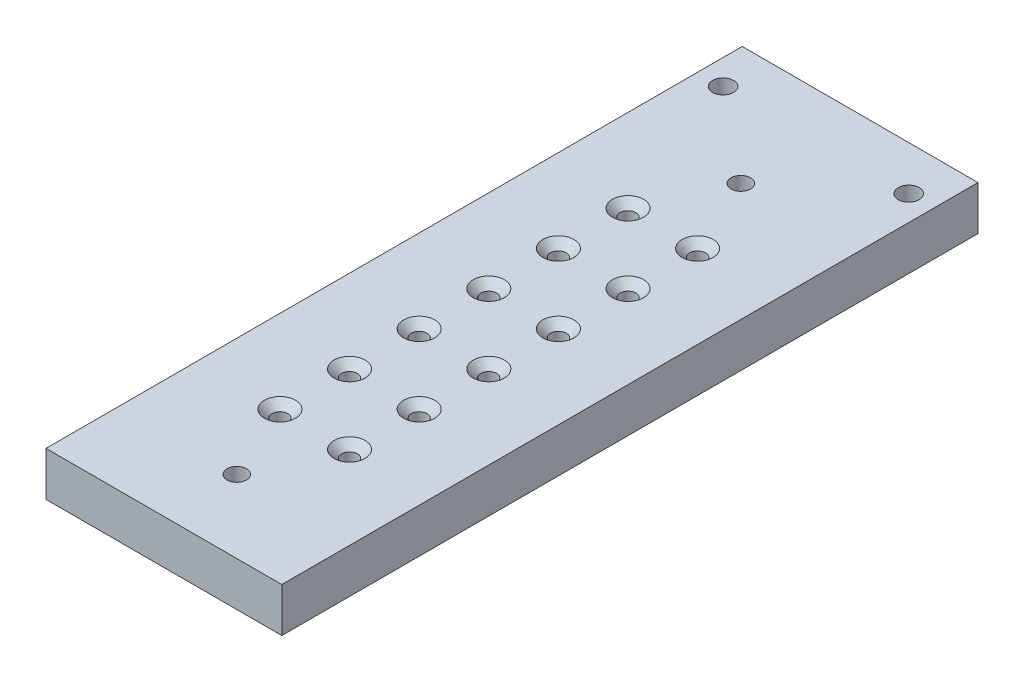
ISO-10303-21;
HEADER;
FILE_DESCRIPTION(('STEP AP214'),'2;1');
FILE_NAME('part.step','',(''),(''),'','','');
FILE_SCHEMA(('AUTOMOTIVE_DESIGN { 1 0 10303 214 1 1 1 1 }'));
ENDSEC;
DATA;
#1=APPLICATION_CONTEXT('core data for automotive mechanical design processes');
#2=APPLICATION_PROTOCOL_DEFINITION('international standard','automotive_design',2000,#1);
#3=PRODUCT_CONTEXT('',#1,'mechanical');
#4=PRODUCT('Part','Part','',(#3));
#5=PRODUCT_RELATED_PRODUCT_CATEGORY('part','',(#4));
#6=PRODUCT_DEFINITION_FORMATION('','',#4);
#7=PRODUCT_DEFINITION_CONTEXT('part definition',#1,'design');
#8=PRODUCT_DEFINITION('design','',#6,#7);
#9=PRODUCT_DEFINITION_SHAPE('','',#8);
#10=(LENGTH_UNIT() NAMED_UNIT(*) SI_UNIT(.MILLI.,.METRE.));
#11=(NAMED_UNIT(*) PLANE_ANGLE_UNIT() SI_UNIT($,.RADIAN.));
#12=(NAMED_UNIT(*) SI_UNIT($,.STERADIAN.) SOLID_ANGLE_UNIT());
#13=UNCERTAINTY_MEASURE_WITH_UNIT(LENGTH_MEASURE(1.E-05),#10,'distance_accuracy_value','');
#14=(GEOMETRIC_REPRESENTATION_CONTEXT(3) GLOBAL_UNCERTAINTY_ASSIGNED_CONTEXT((#13)) GLOBAL_UNIT_ASSIGNED_CONTEXT((#10,
#11,#12)) REPRESENTATION_CONTEXT('',''));
#15=CARTESIAN_POINT('',(0.,0.,0.));
#16=DIRECTION('',(0.,0.,1.));
#17=DIRECTION('',(1.,0.,0.));
#18=AXIS2_PLACEMENT_3D('',#15,#16,#17);
#19=CARTESIAN_POINT('',(-7.5,4.7625,42.5));
#20=DIRECTION('',(0.,1.,0.));
#21=DIRECTION('',(0.,0.,1.));
#22=AXIS2_PLACEMENT_3D('',#19,#20,#21);
#23=CONICAL_SURFACE('',#22,3.36,0.785398163397449);
#24=CARTESIAN_POINT('',(-7.5,3.1025,42.5));
#25=DIRECTION('',(0.,1.,0.));
#26=DIRECTION('',(0.,0.,1.));
#27=AXIS2_PLACEMENT_3D('',#24,#25,#26);
#28=CIRCLE('',#27,1.7);
#29=CARTESIAN_POINT('',(-7.5,3.1025,44.2));
#30=VERTEX_POINT('',#29);
#31=EDGE_CURVE('E11',#30,#30,#28,.T.);
#32=ORIENTED_EDGE('',*,*,#31,.F.);
#33=EDGE_LOOP('',(#32));
#34=FACE_BOUND('',#33,.T.);
#35=CARTESIAN_POINT('',(-7.5,4.7625,42.5));
#36=DIRECTION('',(0.,1.,0.));
#37=DIRECTION('',(0.,0.,1.));
#38=AXIS2_PLACEMENT_3D('',#35,#36,#37);
#39=CIRCLE('',#38,3.36);
#40=CARTESIAN_POINT('',(-7.5,4.7625,45.86));
#41=VERTEX_POINT('',#40);
#42=EDGE_CURVE('E174',#41,#41,#39,.T.);
#43=ORIENTED_EDGE('',*,*,#42,.T.);
#44=EDGE_LOOP('',(#43));
#45=FACE_BOUND('',#44,.T.);
#46=ADVANCED_FACE('F33',(#34,#45),#23,.F.);
#47=CARTESIAN_POINT('',(-7.5,4.7625,42.5));
#48=DIRECTION('',(0.,1.,0.));
#49=DIRECTION('',(0.,0.,1.));
#50=AXIS2_PLACEMENT_3D('',#47,#48,#49);
#51=CYLINDRICAL_SURFACE('',#50,1.7);
#52=CARTESIAN_POINT('',(-7.5,-4.7625,42.5));
#53=DIRECTION('',(0.,1.,0.));
#54=DIRECTION('',(0.,0.,1.));
#55=AXIS2_PLACEMENT_3D('',#52,#53,#54);
#56=CIRCLE('',#55,1.7);
#57=CARTESIAN_POINT('',(-7.5,-4.7625,44.2));
#58=VERTEX_POINT('',#57);
#59=EDGE_CURVE('E41',#58,#58,#56,.T.);
#60=ORIENTED_EDGE('',*,*,#59,.F.);
#61=EDGE_LOOP('',(#60));
#62=FACE_BOUND('',#61,.T.);
#63=ORIENTED_EDGE('',*,*,#31,.T.);
#64=EDGE_LOOP('',(#63));
#65=FACE_BOUND('',#64,.T.);
#66=ADVANCED_FACE('F181',(#62,#65),#51,.F.);
#67=CARTESIAN_POINT('',(-7.5,4.7625,27.5));
#68=DIRECTION('',(0.,1.,0.));
#69=DIRECTION('',(0.,0.,1.));
#70=AXIS2_PLACEMENT_3D('',#67,#68,#69);
#71=CONICAL_SURFACE('',#70,3.36,0.785398163397449);
#72=CARTESIAN_POINT('',(-7.5,3.1025,27.5));
#73=DIRECTION('',(0.,1.,0.));
#74=DIRECTION('',(0.,0.,1.));
#75=AXIS2_PLACEMENT_3D('',#72,#73,#74);
#76=CIRCLE('',#75,1.7);
#77=CARTESIAN_POINT('',(-7.5,3.1025,29.2));
#78=VERTEX_POINT('',#77);
#79=EDGE_CURVE('E171',#78,#78,#76,.T.);
#80=ORIENTED_EDGE('',*,*,#79,.F.);
#81=EDGE_LOOP('',(#80));
#82=FACE_BOUND('',#81,.T.);
#83=CARTESIAN_POINT('',(-7.5,4.7625,27.5));
#84=DIRECTION('',(0.,1.,0.));
#85=DIRECTION('',(0.,0.,1.));
#86=AXIS2_PLACEMENT_3D('',#83,#84,#85);
#87=CIRCLE('',#86,3.36);
#88=CARTESIAN_POINT('',(-7.5,4.7625,30.86));
#89=VERTEX_POINT('',#88);
#90=EDGE_CURVE('E165',#89,#89,#87,.T.);
#91=ORIENTED_EDGE('',*,*,#90,.T.);
#92=EDGE_LOOP('',(#91));
#93=FACE_BOUND('',#92,.T.);
#94=ADVANCED_FACE('F184',(#82,#93),#71,.F.);
#95=CARTESIAN_POINT('',(-7.5,4.7625,27.5));
#96=DIRECTION('',(0.,1.,0.));
#97=DIRECTION('',(0.,0.,1.));
#98=AXIS2_PLACEMENT_3D('',#95,#96,#97);
#99=CYLINDRICAL_SURFACE('',#98,1.7);
#100=CARTESIAN_POINT('',(-7.5,-4.7625,27.5));
#101=DIRECTION('',(0.,1.,0.));
#102=DIRECTION('',(0.,0.,1.));
#103=AXIS2_PLACEMENT_3D('',#100,#101,#102);
#104=CIRCLE('',#103,1.7);
#105=CARTESIAN_POINT('',(-7.5,-4.7625,29.2));
#106=VERTEX_POINT('',#105);
#107=EDGE_CURVE('E168',#106,#106,#104,.T.);
#108=ORIENTED_EDGE('',*,*,#107,.F.);
#109=EDGE_LOOP('',(#108));
#110=FACE_BOUND('',#109,.T.);
#111=ORIENTED_EDGE('',*,*,#79,.T.);
#112=EDGE_LOOP('',(#111));
#113=FACE_BOUND('',#112,.T.);
#114=ADVANCED_FACE('F252',(#110,#113),#99,.F.);
#115=CARTESIAN_POINT('',(-7.5,4.7625,12.5));
#116=DIRECTION('',(0.,1.,0.));
#117=DIRECTION('',(0.,0.,1.));
#118=AXIS2_PLACEMENT_3D('',#115,#116,#117);
#119=CONICAL_SURFACE('',#118,3.36,0.785398163397449);
#120=CARTESIAN_POINT('',(-7.5,3.1025,12.5));
#121=DIRECTION('',(0.,1.,0.));
#122=DIRECTION('',(0.,0.,1.));
#123=AXIS2_PLACEMENT_3D('',#120,#121,#122);
#124=CIRCLE('',#123,1.7);
#125=CARTESIAN_POINT('',(-7.5,3.1025,14.2));
#126=VERTEX_POINT('',#125);
#127=EDGE_CURVE('E162',#126,#126,#124,.T.);
#128=ORIENTED_EDGE('',*,*,#127,.F.);
#129=EDGE_LOOP('',(#128));
#130=FACE_BOUND('',#129,.T.);
#131=CARTESIAN_POINT('',(-7.5,4.7625,12.5));
#132=DIRECTION('',(0.,1.,0.));
#133=DIRECTION('',(0.,0.,1.));
#134=AXIS2_PLACEMENT_3D('',#131,#132,#133);
#135=CIRCLE('',#134,3.36);
#136=CARTESIAN_POINT('',(-7.5,4.7625,15.86));
#137=VERTEX_POINT('',#136);
#138=EDGE_CURVE('E156',#137,#137,#135,.T.);
#139=ORIENTED_EDGE('',*,*,#138,.T.);
#140=EDGE_LOOP('',(#139));
#141=FACE_BOUND('',#140,.T.);
#142=ADVANCED_FACE('F248',(#130,#141),#119,.F.);
#143=CARTESIAN_POINT('',(-7.5,4.7625,12.5));
#144=DIRECTION('',(0.,1.,0.));
#145=DIRECTION('',(0.,0.,1.));
#146=AXIS2_PLACEMENT_3D('',#143,#144,#145);
#147=CYLINDRICAL_SURFACE('',#146,1.7);
#148=CARTESIAN_POINT('',(-7.5,-4.7625,12.5));
#149=DIRECTION('',(0.,1.,0.));
#150=DIRECTION('',(0.,0.,1.));
#151=AXIS2_PLACEMENT_3D('',#148,#149,#150);
#152=CIRCLE('',#151,1.7);
#153=CARTESIAN_POINT('',(-7.5,-4.7625,14.2));
#154=VERTEX_POINT('',#153);
#155=EDGE_CURVE('E159',#154,#154,#152,.T.);
#156=ORIENTED_EDGE('',*,*,#155,.F.);
#157=EDGE_LOOP('',(#156));
#158=FACE_BOUND('',#157,.T.);
#159=ORIENTED_EDGE('',*,*,#127,.T.);
#160=EDGE_LOOP('',(#159));
#161=FACE_BOUND('',#160,.T.);
#162=ADVANCED_FACE('F244',(#158,#161),#147,.F.);
#163=CARTESIAN_POINT('',(-7.5,4.7625,-2.5));
#164=DIRECTION('',(0.,1.,0.));
#165=DIRECTION('',(0.,0.,1.));
#166=AXIS2_PLACEMENT_3D('',#163,#164,#165);
#167=CONICAL_SURFACE('',#166,3.36,0.785398163397449);
#168=CARTESIAN_POINT('',(-7.5,3.1025,-2.5));
#169=DIRECTION('',(0.,1.,0.));
#170=DIRECTION('',(0.,0.,1.));
#171=AXIS2_PLACEMENT_3D('',#168,#169,#170);
#172=CIRCLE('',#171,1.7);
#173=CARTESIAN_POINT('',(-7.5,3.1025,-0.800000000000004));
#174=VERTEX_POINT('',#173);
#175=EDGE_CURVE('E153',#174,#174,#172,.T.);
#176=ORIENTED_EDGE('',*,*,#175,.F.);
#177=EDGE_LOOP('',(#176));
#178=FACE_BOUND('',#177,.T.);
#179=CARTESIAN_POINT('',(-7.5,4.7625,-2.5));
#180=DIRECTION('',(0.,1.,0.));
#181=DIRECTION('',(0.,0.,1.));
#182=AXIS2_PLACEMENT_3D('',#179,#180,#181);
#183=CIRCLE('',#182,3.36);
#184=CARTESIAN_POINT('',(-7.5,4.7625,0.859999999999998));
#185=VERTEX_POINT('',#184);
#186=EDGE_CURVE('E147',#185,#185,#183,.T.);
#187=ORIENTED_EDGE('',*,*,#186,.T.);
#188=EDGE_LOOP('',(#187));
#189=FACE_BOUND('',#188,.T.);
#190=ADVANCED_FACE('F240',(#178,#189),#167,.F.);
#191=CARTESIAN_POINT('',(-7.5,4.7625,-2.5));
#192=DIRECTION('',(0.,1.,0.));
#193=DIRECTION('',(0.,0.,1.));
#194=AXIS2_PLACEMENT_3D('',#191,#192,#193);
#195=CYLINDRICAL_SURFACE('',#194,1.7);
#196=CARTESIAN_POINT('',(-7.5,-4.7625,-2.5));
#197=DIRECTION('',(0.,1.,0.));
#198=DIRECTION('',(0.,0.,1.));
#199=AXIS2_PLACEMENT_3D('',#196,#197,#198);
#200=CIRCLE('',#199,1.7);
#201=CARTESIAN_POINT('',(-7.5,-4.7625,-0.800000000000005));
#202=VERTEX_POINT('',#201);
#203=EDGE_CURVE('E150',#202,#202,#200,.T.);
#204=ORIENTED_EDGE('',*,*,#203,.F.);
#205=EDGE_LOOP('',(#204));
#206=FACE_BOUND('',#205,.T.);
#207=ORIENTED_EDGE('',*,*,#175,.T.);
#208=EDGE_LOOP('',(#207));
#209=FACE_BOUND('',#208,.T.);
#210=ADVANCED_FACE('F236',(#206,#209),#195,.F.);
#211=CARTESIAN_POINT('',(7.5,4.7625,42.5));
#212=DIRECTION('',(0.,1.,0.));
#213=DIRECTION('',(0.,0.,1.));
#214=AXIS2_PLACEMENT_3D('',#211,#212,#213);
#215=CONICAL_SURFACE('',#214,3.36,0.785398163397449);
#216=CARTESIAN_POINT('',(7.5,3.1025,42.5));
#217=DIRECTION('',(0.,1.,0.));
#218=DIRECTION('',(0.,0.,1.));
#219=AXIS2_PLACEMENT_3D('',#216,#217,#218);
#220=CIRCLE('',#219,1.7);
#221=CARTESIAN_POINT('',(7.5,3.1025,44.2));
#222=VERTEX_POINT('',#221);
#223=EDGE_CURVE('E144',#222,#222,#220,.T.);
#224=ORIENTED_EDGE('',*,*,#223,.F.);
#225=EDGE_LOOP('',(#224));
#226=FACE_BOUND('',#225,.T.);
#227=CARTESIAN_POINT('',(7.5,4.7625,42.5));
#228=DIRECTION('',(0.,1.,0.));
#229=DIRECTION('',(0.,0.,1.));
#230=AXIS2_PLACEMENT_3D('',#227,#228,#229);
#231=CIRCLE('',#230,3.36);
#232=CARTESIAN_POINT('',(7.5,4.7625,45.86));
#233=VERTEX_POINT('',#232);
#234=EDGE_CURVE('E138',#233,#233,#231,.T.);
#235=ORIENTED_EDGE('',*,*,#234,.T.);
#236=EDGE_LOOP('',(#235));
#237=FACE_BOUND('',#236,.T.);
#238=ADVANCED_FACE('F232',(#226,#237),#215,.F.);
#239=CARTESIAN_POINT('',(7.5,4.7625,42.5));
#240=DIRECTION('',(0.,1.,0.));
#241=DIRECTION('',(0.,0.,1.));
#242=AXIS2_PLACEMENT_3D('',#239,#240,#241);
#243=CYLINDRICAL_SURFACE('',#242,1.7);
#244=CARTESIAN_POINT('',(7.5,-4.7625,42.5));
#245=DIRECTION('',(0.,1.,0.));
#246=DIRECTION('',(0.,0.,1.));
#247=AXIS2_PLACEMENT_3D('',#244,#245,#246);
#248=CIRCLE('',#247,1.7);
#249=CARTESIAN_POINT('',(7.5,-4.7625,44.2));
#250=VERTEX_POINT('',#249);
#251=EDGE_CURVE('E141',#250,#250,#248,.T.);
#252=ORIENTED_EDGE('',*,*,#251,.F.);
#253=EDGE_LOOP('',(#252));
#254=FACE_BOUND('',#253,.T.);
#255=ORIENTED_EDGE('',*,*,#223,.T.);
#256=EDGE_LOOP('',(#255));
#257=FACE_BOUND('',#256,.T.);
#258=ADVANCED_FACE('F228',(#254,#257),#243,.F.);
#259=CARTESIAN_POINT('',(7.5,4.7625,27.5));
#260=DIRECTION('',(0.,1.,0.));
#261=DIRECTION('',(0.,0.,1.));
#262=AXIS2_PLACEMENT_3D('',#259,#260,#261);
#263=CONICAL_SURFACE('',#262,3.36,0.785398163397449);
#264=CARTESIAN_POINT('',(7.5,3.1025,27.5));
#265=DIRECTION('',(0.,1.,0.));
#266=DIRECTION('',(0.,0.,1.));
#267=AXIS2_PLACEMENT_3D('',#264,#265,#266);
#268=CIRCLE('',#267,1.7);
#269=CARTESIAN_POINT('',(7.5,3.1025,29.2));
#270=VERTEX_POINT('',#269);
#271=EDGE_CURVE('E135',#270,#270,#268,.T.);
#272=ORIENTED_EDGE('',*,*,#271,.F.);
#273=EDGE_LOOP('',(#272));
#274=FACE_BOUND('',#273,.T.);
#275=CARTESIAN_POINT('',(7.5,4.7625,27.5));
#276=DIRECTION('',(0.,1.,0.));
#277=DIRECTION('',(0.,0.,1.));
#278=AXIS2_PLACEMENT_3D('',#275,#276,#277);
#279=CIRCLE('',#278,3.36);
#280=CARTESIAN_POINT('',(7.5,4.7625,30.86));
#281=VERTEX_POINT('',#280);
#282=EDGE_CURVE('E129',#281,#281,#279,.T.);
#283=ORIENTED_EDGE('',*,*,#282,.T.);
#284=EDGE_LOOP('',(#283));
#285=FACE_BOUND('',#284,.T.);
#286=ADVANCED_FACE('F224',(#274,#285),#263,.F.);
#287=CARTESIAN_POINT('',(7.5,4.7625,27.5));
#288=DIRECTION('',(0.,1.,0.));
#289=DIRECTION('',(0.,0.,1.));
#290=AXIS2_PLACEMENT_3D('',#287,#288,#289);
#291=CYLINDRICAL_SURFACE('',#290,1.7);
#292=CARTESIAN_POINT('',(7.5,-4.7625,27.5));
#293=DIRECTION('',(0.,1.,0.));
#294=DIRECTION('',(0.,0.,1.));
#295=AXIS2_PLACEMENT_3D('',#292,#293,#294);
#296=CIRCLE('',#295,1.7);
#297=CARTESIAN_POINT('',(7.5,-4.7625,29.2));
#298=VERTEX_POINT('',#297);
#299=EDGE_CURVE('E132',#298,#298,#296,.T.);
#300=ORIENTED_EDGE('',*,*,#299,.F.);
#301=EDGE_LOOP('',(#300));
#302=FACE_BOUND('',#301,.T.);
#303=ORIENTED_EDGE('',*,*,#271,.T.);
#304=EDGE_LOOP('',(#303));
#305=FACE_BOUND('',#304,.T.);
#306=ADVANCED_FACE('F220',(#302,#305),#291,.F.);
#307=CARTESIAN_POINT('',(7.5,4.7625,12.5));
#308=DIRECTION('',(0.,1.,0.));
#309=DIRECTION('',(0.,0.,1.));
#310=AXIS2_PLACEMENT_3D('',#307,#308,#309);
#311=CONICAL_SURFACE('',#310,3.36,0.785398163397449);
#312=CARTESIAN_POINT('',(7.5,3.1025,12.5));
#313=DIRECTION('',(0.,1.,0.));
#314=DIRECTION('',(0.,0.,1.));
#315=AXIS2_PLACEMENT_3D('',#312,#313,#314);
#316=CIRCLE('',#315,1.7);
#317=CARTESIAN_POINT('',(7.5,3.1025,14.2));
#318=VERTEX_POINT('',#317);
#319=EDGE_CURVE('E126',#318,#318,#316,.T.);
#320=ORIENTED_EDGE('',*,*,#319,.F.);
#321=EDGE_LOOP('',(#320));
#322=FACE_BOUND('',#321,.T.);
#323=CARTESIAN_POINT('',(7.5,4.7625,12.5));
#324=DIRECTION('',(0.,1.,0.));
#325=DIRECTION('',(0.,0.,1.));
#326=AXIS2_PLACEMENT_3D('',#323,#324,#325);
#327=CIRCLE('',#326,3.36);
#328=CARTESIAN_POINT('',(7.5,4.7625,15.86));
#329=VERTEX_POINT('',#328);
#330=EDGE_CURVE('E120',#329,#329,#327,.T.);
#331=ORIENTED_EDGE('',*,*,#330,.T.);
#332=EDGE_LOOP('',(#331));
#333=FACE_BOUND('',#332,.T.);
#334=ADVANCED_FACE('F216',(#322,#333),#311,.F.);
#335=CARTESIAN_POINT('',(7.5,4.7625,12.5));
#336=DIRECTION('',(0.,1.,0.));
#337=DIRECTION('',(0.,0.,1.));
#338=AXIS2_PLACEMENT_3D('',#335,#336,#337);
#339=CYLINDRICAL_SURFACE('',#338,1.7);
#340=CARTESIAN_POINT('',(7.5,-4.7625,12.5));
#341=DIRECTION('',(0.,1.,0.));
#342=DIRECTION('',(0.,0.,1.));
#343=AXIS2_PLACEMENT_3D('',#340,#341,#342);
#344=CIRCLE('',#343,1.7);
#345=CARTESIAN_POINT('',(7.5,-4.7625,14.2));
#346=VERTEX_POINT('',#345);
#347=EDGE_CURVE('E123',#346,#346,#344,.T.);
#348=ORIENTED_EDGE('',*,*,#347,.F.);
#349=EDGE_LOOP('',(#348));
#350=FACE_BOUND('',#349,.T.);
#351=ORIENTED_EDGE('',*,*,#319,.T.);
#352=EDGE_LOOP('',(#351));
#353=FACE_BOUND('',#352,.T.);
#354=ADVANCED_FACE('F212',(#350,#353),#339,.F.);
#355=CARTESIAN_POINT('',(7.5,4.7625,-2.5));
#356=DIRECTION('',(0.,1.,0.));
#357=DIRECTION('',(0.,0.,1.));
#358=AXIS2_PLACEMENT_3D('',#355,#356,#357);
#359=CONICAL_SURFACE('',#358,3.36,0.785398163397449);
#360=CARTESIAN_POINT('',(7.5,3.1025,-2.5));
#361=DIRECTION('',(0.,1.,0.));
#362=DIRECTION('',(0.,0.,1.));
#363=AXIS2_PLACEMENT_3D('',#360,#361,#362);
#364=CIRCLE('',#363,1.7);
#365=CARTESIAN_POINT('',(7.5,3.1025,-0.800000000000004));
#366=VERTEX_POINT('',#365);
#367=EDGE_CURVE('E117',#366,#366,#364,.T.);
#368=ORIENTED_EDGE('',*,*,#367,.F.);
#369=EDGE_LOOP('',(#368));
#370=FACE_BOUND('',#369,.T.);
#371=CARTESIAN_POINT('',(7.5,4.7625,-2.5));
#372=DIRECTION('',(0.,1.,0.));
#373=DIRECTION('',(0.,0.,1.));
#374=AXIS2_PLACEMENT_3D('',#371,#372,#373);
#375=CIRCLE('',#374,3.36);
#376=CARTESIAN_POINT('',(7.5,4.7625,0.859999999999998));
#377=VERTEX_POINT('',#376);
#378=EDGE_CURVE('E111',#377,#377,#375,.T.);
#379=ORIENTED_EDGE('',*,*,#378,.T.);
#380=EDGE_LOOP('',(#379));
#381=FACE_BOUND('',#380,.T.);
#382=ADVANCED_FACE('F202',(#370,#381),#359,.F.);
#383=CARTESIAN_POINT('',(7.5,4.7625,-2.5));
#384=DIRECTION('',(0.,1.,0.));
#385=DIRECTION('',(0.,0.,1.));
#386=AXIS2_PLACEMENT_3D('',#383,#384,#385);
#387=CYLINDRICAL_SURFACE('',#386,1.7);
#388=CARTESIAN_POINT('',(7.5,-4.7625,-2.5));
#389=DIRECTION('',(0.,1.,0.));
#390=DIRECTION('',(0.,0.,1.));
#391=AXIS2_PLACEMENT_3D('',#388,#389,#390);
#392=CIRCLE('',#391,1.7);
#393=CARTESIAN_POINT('',(7.5,-4.7625,-0.800000000000006));
#394=VERTEX_POINT('',#393);
#395=EDGE_CURVE('E114',#394,#394,#392,.T.);
#396=ORIENTED_EDGE('',*,*,#395,.F.);
#397=EDGE_LOOP('',(#396));
#398=FACE_BOUND('',#397,.T.);
#399=ORIENTED_EDGE('',*,*,#367,.T.);
#400=EDGE_LOOP('',(#399));
#401=FACE_BOUND('',#400,.T.);
#402=ADVANCED_FACE('F193',(#398,#401),#387,.F.);
#403=CARTESIAN_POINT('',(-25.4,4.7625,75.));
#404=DIRECTION('',(0.,-1.,0.));
#405=DIRECTION('',(0.,0.,-1.));
#406=AXIS2_PLACEMENT_3D('',#403,#404,#405);
#407=PLANE('',#406);
#408=CARTESIAN_POINT('',(-7.5,4.7625,-17.5));
#409=DIRECTION('',(0.,1.,0.));
#410=DIRECTION('',(0.,0.,1.));
#411=AXIS2_PLACEMENT_3D('',#408,#409,#410);
#412=CIRCLE('',#411,3.36);
#413=CARTESIAN_POINT('',(-7.5,4.7625,-14.14));
#414=VERTEX_POINT('',#413);
#415=EDGE_CURVE('E525',#414,#414,#412,.T.);
#416=ORIENTED_EDGE('',*,*,#415,.F.);
#417=EDGE_LOOP('',(#416));
#418=FACE_BOUND('',#417,.T.);
#419=CARTESIAN_POINT('',(7.5,4.7625,-17.5));
#420=DIRECTION('',(0.,1.,0.));
#421=DIRECTION('',(0.,0.,1.));
#422=AXIS2_PLACEMENT_3D('',#419,#420,#421);
#423=CIRCLE('',#422,3.36);
#424=CARTESIAN_POINT('',(7.5,4.7625,-14.14));
#425=VERTEX_POINT('',#424);
#426=EDGE_CURVE('E516',#425,#425,#423,.T.);
#427=ORIENTED_EDGE('',*,*,#426,.F.);
#428=EDGE_LOOP('',(#427));
#429=FACE_BOUND('',#428,.T.);
#430=CARTESIAN_POINT('',(7.5,4.7625,-32.5));
#431=DIRECTION('',(0.,1.,0.));
#432=DIRECTION('',(0.,0.,1.));
#433=AXIS2_PLACEMENT_3D('',#430,#431,#432);
#434=CIRCLE('',#433,3.36);
#435=CARTESIAN_POINT('',(7.5,4.7625,-29.14));
#436=VERTEX_POINT('',#435);
#437=EDGE_CURVE('E507',#436,#436,#434,.T.);
#438=ORIENTED_EDGE('',*,*,#437,.F.);
#439=EDGE_LOOP('',(#438));
#440=FACE_BOUND('',#439,.T.);
#441=CARTESIAN_POINT('',(-20.,4.7625,-65.475));
#442=DIRECTION('',(0.,1.,0.));
#443=DIRECTION('',(0.,0.,1.));
#444=AXIS2_PLACEMENT_3D('',#441,#442,#443);
#445=CIRCLE('',#444,2.25);
#446=CARTESIAN_POINT('',(-20.,4.7625,-63.225));
#447=VERTEX_POINT('',#446);
#448=EDGE_CURVE('E489',#447,#447,#445,.T.);
#449=ORIENTED_EDGE('',*,*,#448,.F.);
#450=EDGE_LOOP('',(#449));
#451=FACE_BOUND('',#450,.T.);
#452=CARTESIAN_POINT('',(20.,4.7625,-65.475));
#453=DIRECTION('',(0.,1.,0.));
#454=DIRECTION('',(0.,0.,1.));
#455=AXIS2_PLACEMENT_3D('',#452,#453,#454);
#456=CIRCLE('',#455,2.25);
#457=CARTESIAN_POINT('',(20.,4.7625,-63.225));
#458=VERTEX_POINT('',#457);
#459=EDGE_CURVE('E483',#458,#458,#456,.T.);
#460=ORIENTED_EDGE('',*,*,#459,.F.);
#461=EDGE_LOOP('',(#460));
#462=FACE_BOUND('',#461,.T.);
#463=CARTESIAN_POINT('',(0.,4.7625,-49.3));
#464=DIRECTION('',(0.,1.,0.));
#465=DIRECTION('',(0.,0.,1.));
#466=AXIS2_PLACEMENT_3D('',#463,#464,#465);
#467=CIRCLE('',#466,2.09999999999999);
#468=CARTESIAN_POINT('',(0.,4.7625,-47.2));
#469=VERTEX_POINT('',#468);
#470=EDGE_CURVE('E471',#469,#469,#467,.T.);
#471=ORIENTED_EDGE('',*,*,#470,.F.);
#472=EDGE_LOOP('',(#471));
#473=FACE_BOUND('',#472,.T.);
#474=DIRECTION('',(-1.,0.,0.));
#475=VECTOR('',#474,1.);
#476=CARTESIAN_POINT('',(-25.4,4.7625,-75.));
#477=LINE('',#476,#475);
#478=CARTESIAN_POINT('',(25.4,4.7625,-75.));
#479=VERTEX_POINT('',#478);
#480=CARTESIAN_POINT('',(-25.4,4.7625,-75.));
#481=VERTEX_POINT('',#480);
#482=EDGE_CURVE('E91',#479,#481,#477,.T.);
#483=ORIENTED_EDGE('',*,*,#482,.T.);
#484=DIRECTION('',(0.,0.,-1.));
#485=VECTOR('',#484,1.);
#486=CARTESIAN_POINT('',(-25.4,4.7625,75.));
#487=LINE('',#486,#485);
#488=CARTESIAN_POINT('',(-25.4,4.7625,75.));
#489=VERTEX_POINT('',#488);
#490=EDGE_CURVE('E88',#489,#481,#487,.T.);
#491=ORIENTED_EDGE('',*,*,#490,.F.);
#492=DIRECTION('',(-1.,0.,0.));
#493=VECTOR('',#492,1.);
#494=CARTESIAN_POINT('',(-25.4,4.7625,75.));
#495=LINE('',#494,#493);
#496=CARTESIAN_POINT('',(25.4,4.7625,75.));
#497=VERTEX_POINT('',#496);
#498=EDGE_CURVE('E80',#497,#489,#495,.T.);
#499=ORIENTED_EDGE('',*,*,#498,.F.);
#500=DIRECTION('',(0.,0.,-1.));
#501=VECTOR('',#500,1.);
#502=CARTESIAN_POINT('',(25.4,4.7625,75.));
#503=LINE('',#502,#501);
#504=EDGE_CURVE('E92',#497,#479,#503,.T.);
#505=ORIENTED_EDGE('',*,*,#504,.T.);
#506=EDGE_LOOP('',(#483,#491,#499,#505));
#507=FACE_BOUND('',#506,.T.);
#508=CARTESIAN_POINT('',(0.,4.7625,59.3));
#509=DIRECTION('',(0.,1.,0.));
#510=DIRECTION('',(0.,0.,1.));
#511=AXIS2_PLACEMENT_3D('',#508,#509,#510);
#512=CIRCLE('',#511,2.09999999999999);
#513=CARTESIAN_POINT('',(0.,4.7625,61.4));
#514=VERTEX_POINT('',#513);
#515=EDGE_CURVE('E477',#514,#514,#512,.T.);
#516=ORIENTED_EDGE('',*,*,#515,.F.);
#517=EDGE_LOOP('',(#516));
#518=FACE_BOUND('',#517,.T.);
#519=CARTESIAN_POINT('',(-7.5,4.7625,-32.5));
#520=DIRECTION('',(0.,1.,0.));
#521=DIRECTION('',(0.,0.,1.));
#522=AXIS2_PLACEMENT_3D('',#519,#520,#521);
#523=CIRCLE('',#522,3.36);
#524=CARTESIAN_POINT('',(-7.5,4.7625,-29.14));
#525=VERTEX_POINT('',#524);
#526=EDGE_CURVE('E498',#525,#525,#523,.T.);
#527=ORIENTED_EDGE('',*,*,#526,.F.);
#528=EDGE_LOOP('',(#527));
#529=FACE_BOUND('',#528,.T.);
#530=ORIENTED_EDGE('',*,*,#378,.F.);
#531=EDGE_LOOP('',(#530));
#532=FACE_BOUND('',#531,.T.);
#533=ORIENTED_EDGE('',*,*,#330,.F.);
#534=EDGE_LOOP('',(#533));
#535=FACE_BOUND('',#534,.T.);
#536=ORIENTED_EDGE('',*,*,#282,.F.);
#537=EDGE_LOOP('',(#536));
#538=FACE_BOUND('',#537,.T.);
#539=ORIENTED_EDGE('',*,*,#234,.F.);
#540=EDGE_LOOP('',(#539));
#541=FACE_BOUND('',#540,.T.);
#542=ORIENTED_EDGE('',*,*,#186,.F.);
#543=EDGE_LOOP('',(#542));
#544=FACE_BOUND('',#543,.T.);
#545=ORIENTED_EDGE('',*,*,#138,.F.);
#546=EDGE_LOOP('',(#545));
#547=FACE_BOUND('',#546,.T.);
#548=ORIENTED_EDGE('',*,*,#90,.F.);
#549=EDGE_LOOP('',(#548));
#550=FACE_BOUND('',#549,.T.);
#551=ORIENTED_EDGE('',*,*,#42,.F.);
#552=EDGE_LOOP('',(#551));
#553=FACE_BOUND('',#552,.T.);
#554=ADVANCED_FACE('F89',(#418,#429,#440,#451,#462,#473,#507,#518,#529,#532,#535,#538,#541,#544,
#547,#550,#553),#407,.F.);
#555=CARTESIAN_POINT('',(25.4,-4.7625,75.));
#556=DIRECTION('',(-1.,0.,0.));
#557=DIRECTION('',(0.,0.,1.));
#558=AXIS2_PLACEMENT_3D('',#555,#556,#557);
#559=PLANE('',#558);
#560=DIRECTION('',(0.,1.,0.));
#561=VECTOR('',#560,1.);
#562=CARTESIAN_POINT('',(25.4,-4.7625,-75.));
#563=LINE('',#562,#561);
#564=CARTESIAN_POINT('',(25.4,-4.7625,-75.));
#565=VERTEX_POINT('',#564);
#566=EDGE_CURVE('E101',#565,#479,#563,.T.);
#567=ORIENTED_EDGE('',*,*,#566,.T.);
#568=ORIENTED_EDGE('',*,*,#504,.F.);
#569=DIRECTION('',(0.,1.,0.));
#570=VECTOR('',#569,1.);
#571=CARTESIAN_POINT('',(25.4,-4.7625,75.));
#572=LINE('',#571,#570);
#573=CARTESIAN_POINT('',(25.4,-4.7625,75.));
#574=VERTEX_POINT('',#573);
#575=EDGE_CURVE('E85',#574,#497,#572,.T.);
#576=ORIENTED_EDGE('',*,*,#575,.F.);
#577=DIRECTION('',(0.,0.,-1.));
#578=VECTOR('',#577,1.);
#579=CARTESIAN_POINT('',(25.4,-4.7625,75.));
#580=LINE('',#579,#578);
#581=EDGE_CURVE('E97',#574,#565,#580,.T.);
#582=ORIENTED_EDGE('',*,*,#581,.T.);
#583=EDGE_LOOP('',(#567,#568,#576,#582));
#584=FACE_BOUND('',#583,.T.);
#585=ADVANCED_FACE('F192',(#584),#559,.F.);
#586=CARTESIAN_POINT('',(-25.4,-4.7625,75.));
#587=DIRECTION('',(1.,0.,0.));
#588=DIRECTION('',(0.,0.,-1.));
#589=AXIS2_PLACEMENT_3D('',#586,#587,#588);
#590=PLANE('',#589);
#591=DIRECTION('',(0.,-1.,0.));
#592=VECTOR('',#591,1.);
#593=CARTESIAN_POINT('',(-25.4,-4.7625,-75.));
#594=LINE('',#593,#592);
#595=CARTESIAN_POINT('',(-25.4,-4.7625,-75.));
#596=VERTEX_POINT('',#595);
#597=EDGE_CURVE('E66',#481,#596,#594,.T.);
#598=ORIENTED_EDGE('',*,*,#597,.T.);
#599=DIRECTION('',(0.,0.,-1.));
#600=VECTOR('',#599,1.);
#601=CARTESIAN_POINT('',(-25.4,-4.7625,75.));
#602=LINE('',#601,#600);
#603=CARTESIAN_POINT('',(-25.4,-4.7625,75.));
#604=VERTEX_POINT('',#603);
#605=EDGE_CURVE('E93',#604,#596,#602,.T.);
#606=ORIENTED_EDGE('',*,*,#605,.F.);
#607=DIRECTION('',(0.,-1.,0.));
#608=VECTOR('',#607,1.);
#609=CARTESIAN_POINT('',(-25.4,-4.7625,75.));
#610=LINE('',#609,#608);
#611=EDGE_CURVE('E83',#489,#604,#610,.T.);
#612=ORIENTED_EDGE('',*,*,#611,.F.);
#613=ORIENTED_EDGE('',*,*,#490,.T.);
#614=EDGE_LOOP('',(#598,#606,#612,#613));
#615=FACE_BOUND('',#614,.T.);
#616=ADVANCED_FACE('F95',(#615),#590,.F.);
#617=CARTESIAN_POINT('',(-25.4,-4.7625,75.));
#618=DIRECTION('',(0.,1.,0.));
#619=DIRECTION('',(0.,0.,1.));
#620=AXIS2_PLACEMENT_3D('',#617,#618,#619);
#621=PLANE('',#620);
#622=CARTESIAN_POINT('',(-7.5,-4.7625,-17.5));
#623=DIRECTION('',(0.,1.,0.));
#624=DIRECTION('',(0.,0.,1.));
#625=AXIS2_PLACEMENT_3D('',#622,#623,#624);
#626=CIRCLE('',#625,1.7);
#627=CARTESIAN_POINT('',(-7.5,-4.7625,-15.8));
#628=VERTEX_POINT('',#627);
#629=EDGE_CURVE('E522',#628,#628,#626,.T.);
#630=ORIENTED_EDGE('',*,*,#629,.T.);
#631=EDGE_LOOP('',(#630));
#632=FACE_BOUND('',#631,.T.);
#633=CARTESIAN_POINT('',(7.5,-4.7625,-17.5));
#634=DIRECTION('',(0.,1.,0.));
#635=DIRECTION('',(0.,0.,1.));
#636=AXIS2_PLACEMENT_3D('',#633,#634,#635);
#637=CIRCLE('',#636,1.7);
#638=CARTESIAN_POINT('',(7.5,-4.7625,-15.8));
#639=VERTEX_POINT('',#638);
#640=EDGE_CURVE('E513',#639,#639,#637,.T.);
#641=ORIENTED_EDGE('',*,*,#640,.T.);
#642=EDGE_LOOP('',(#641));
#643=FACE_BOUND('',#642,.T.);
#644=CARTESIAN_POINT('',(7.5,-4.7625,-32.5));
#645=DIRECTION('',(0.,1.,0.));
#646=DIRECTION('',(0.,0.,1.));
#647=AXIS2_PLACEMENT_3D('',#644,#645,#646);
#648=CIRCLE('',#647,1.7);
#649=CARTESIAN_POINT('',(7.5,-4.7625,-30.8));
#650=VERTEX_POINT('',#649);
#651=EDGE_CURVE('E501',#650,#650,#648,.T.);
#652=ORIENTED_EDGE('',*,*,#651,.T.);
#653=EDGE_LOOP('',(#652));
#654=FACE_BOUND('',#653,.T.);
#655=CARTESIAN_POINT('',(-7.5,-4.7625,-32.5));
#656=DIRECTION('',(0.,1.,0.));
#657=DIRECTION('',(0.,0.,1.));
#658=AXIS2_PLACEMENT_3D('',#655,#656,#657);
#659=CIRCLE('',#658,1.7);
#660=CARTESIAN_POINT('',(-7.5,-4.7625,-30.8));
#661=VERTEX_POINT('',#660);
#662=EDGE_CURVE('E492',#661,#661,#659,.T.);
#663=ORIENTED_EDGE('',*,*,#662,.T.);
#664=EDGE_LOOP('',(#663));
#665=FACE_BOUND('',#664,.T.);
#666=CARTESIAN_POINT('',(-20.,-4.7625,-65.475));
#667=DIRECTION('',(0.,1.,0.));
#668=DIRECTION('',(0.,0.,1.));
#669=AXIS2_PLACEMENT_3D('',#666,#667,#668);
#670=CIRCLE('',#669,2.25);
#671=CARTESIAN_POINT('',(-20.,-4.7625,-63.225));
#672=VERTEX_POINT('',#671);
#673=EDGE_CURVE('E486',#672,#672,#670,.T.);
#674=ORIENTED_EDGE('',*,*,#673,.T.);
#675=EDGE_LOOP('',(#674));
#676=FACE_BOUND('',#675,.T.);
#677=CARTESIAN_POINT('',(20.,-4.7625,-65.475));
#678=DIRECTION('',(0.,1.,0.));
#679=DIRECTION('',(0.,0.,1.));
#680=AXIS2_PLACEMENT_3D('',#677,#678,#679);
#681=CIRCLE('',#680,2.25);
#682=CARTESIAN_POINT('',(20.,-4.7625,-63.225));
#683=VERTEX_POINT('',#682);
#684=EDGE_CURVE('E480',#683,#683,#681,.T.);
#685=ORIENTED_EDGE('',*,*,#684,.T.);
#686=EDGE_LOOP('',(#685));
#687=FACE_BOUND('',#686,.T.);
#688=CARTESIAN_POINT('',(0.,-4.7625,59.3));
#689=DIRECTION('',(0.,1.,0.));
#690=DIRECTION('',(0.,0.,1.));
#691=AXIS2_PLACEMENT_3D('',#688,#689,#690);
#692=CIRCLE('',#691,2.09999999999999);
#693=CARTESIAN_POINT('',(0.,-4.7625,61.4));
#694=VERTEX_POINT('',#693);
#695=EDGE_CURVE('E474',#694,#694,#692,.T.);
#696=ORIENTED_EDGE('',*,*,#695,.T.);
#697=EDGE_LOOP('',(#696));
#698=FACE_BOUND('',#697,.T.);
#699=CARTESIAN_POINT('',(0.,-4.7625,-49.3));
#700=DIRECTION('',(0.,1.,0.));
#701=DIRECTION('',(0.,0.,1.));
#702=AXIS2_PLACEMENT_3D('',#699,#700,#701);
#703=CIRCLE('',#702,2.09999999999999);
#704=CARTESIAN_POINT('',(0.,-4.7625,-47.2));
#705=VERTEX_POINT('',#704);
#706=EDGE_CURVE('E104',#705,#705,#703,.T.);
#707=ORIENTED_EDGE('',*,*,#706,.T.);
#708=EDGE_LOOP('',(#707));
#709=FACE_BOUND('',#708,.T.);
#710=DIRECTION('',(1.,0.,0.));
#711=VECTOR('',#710,1.);
#712=CARTESIAN_POINT('',(-25.4,-4.7625,-75.));
#713=LINE('',#712,#711);
#714=EDGE_CURVE('E72',#596,#565,#713,.T.);
#715=ORIENTED_EDGE('',*,*,#714,.T.);
#716=ORIENTED_EDGE('',*,*,#581,.F.);
#717=DIRECTION('',(1.,0.,0.));
#718=VECTOR('',#717,1.);
#719=CARTESIAN_POINT('',(-25.4,-4.7625,75.));
#720=LINE('',#719,#718);
#721=EDGE_CURVE('E49',#604,#574,#720,.T.);
#722=ORIENTED_EDGE('',*,*,#721,.F.);
#723=ORIENTED_EDGE('',*,*,#605,.T.);
#724=EDGE_LOOP('',(#715,#716,#722,#723));
#725=FACE_BOUND('',#724,.T.);
#726=ORIENTED_EDGE('',*,*,#395,.T.);
#727=EDGE_LOOP('',(#726));
#728=FACE_BOUND('',#727,.T.);
#729=ORIENTED_EDGE('',*,*,#347,.T.);
#730=EDGE_LOOP('',(#729));
#731=FACE_BOUND('',#730,.T.);
#732=ORIENTED_EDGE('',*,*,#299,.T.);
#733=EDGE_LOOP('',(#732));
#734=FACE_BOUND('',#733,.T.);
#735=ORIENTED_EDGE('',*,*,#251,.T.);
#736=EDGE_LOOP('',(#735));
#737=FACE_BOUND('',#736,.T.);
#738=ORIENTED_EDGE('',*,*,#203,.T.);
#739=EDGE_LOOP('',(#738));
#740=FACE_BOUND('',#739,.T.);
#741=ORIENTED_EDGE('',*,*,#155,.T.);
#742=EDGE_LOOP('',(#741));
#743=FACE_BOUND('',#742,.T.);
#744=ORIENTED_EDGE('',*,*,#107,.T.);
#745=EDGE_LOOP('',(#744));
#746=FACE_BOUND('',#745,.T.);
#747=ORIENTED_EDGE('',*,*,#59,.T.);
#748=EDGE_LOOP('',(#747));
#749=FACE_BOUND('',#748,.T.);
#750=ADVANCED_FACE('F179',(#632,#643,#654,#665,#676,#687,#698,#709,#725,#728,#731,#734,#737,
#740,#743,#746,#749),#621,.F.);
#751=CARTESIAN_POINT('',(0.,0.,75.));
#752=DIRECTION('',(0.,0.,-1.));
#753=DIRECTION('',(-1.,0.,0.));
#754=AXIS2_PLACEMENT_3D('',#751,#752,#753);
#755=PLANE('',#754);
#756=ORIENTED_EDGE('',*,*,#575,.T.);
#757=ORIENTED_EDGE('',*,*,#498,.T.);
#758=ORIENTED_EDGE('',*,*,#611,.T.);
#759=ORIENTED_EDGE('',*,*,#721,.T.);
#760=EDGE_LOOP('',(#756,#757,#758,#759));
#761=FACE_BOUND('',#760,.T.);
#762=ADVANCED_FACE('F81',(#761),#755,.F.);
#763=CARTESIAN_POINT('',(0.,0.,-75.));
#764=DIRECTION('',(0.,0.,-1.));
#765=DIRECTION('',(-1.,0.,0.));
#766=AXIS2_PLACEMENT_3D('',#763,#764,#765);
#767=PLANE('',#766);
#768=ORIENTED_EDGE('',*,*,#566,.F.);
#769=ORIENTED_EDGE('',*,*,#714,.F.);
#770=ORIENTED_EDGE('',*,*,#597,.F.);
#771=ORIENTED_EDGE('',*,*,#482,.F.);
#772=EDGE_LOOP('',(#768,#769,#770,#771));
#773=FACE_BOUND('',#772,.T.);
#774=ADVANCED_FACE('F416',(#773),#767,.T.);
#775=CARTESIAN_POINT('',(0.,4.7625,-49.3));
#776=DIRECTION('',(0.,1.,0.));
#777=DIRECTION('',(0.,0.,1.));
#778=AXIS2_PLACEMENT_3D('',#775,#776,#777);
#779=CYLINDRICAL_SURFACE('',#778,2.09999999999999);
#780=ORIENTED_EDGE('',*,*,#706,.F.);
#781=EDGE_LOOP('',(#780));
#782=FACE_BOUND('',#781,.T.);
#783=ORIENTED_EDGE('',*,*,#470,.T.);
#784=EDGE_LOOP('',(#783));
#785=FACE_BOUND('',#784,.T.);
#786=ADVANCED_FACE('F412',(#782,#785),#779,.F.);
#787=CARTESIAN_POINT('',(0.,4.7625,59.3));
#788=DIRECTION('',(0.,1.,0.));
#789=DIRECTION('',(0.,0.,1.));
#790=AXIS2_PLACEMENT_3D('',#787,#788,#789);
#791=CYLINDRICAL_SURFACE('',#790,2.09999999999999);
#792=ORIENTED_EDGE('',*,*,#695,.F.);
#793=EDGE_LOOP('',(#792));
#794=FACE_BOUND('',#793,.T.);
#795=ORIENTED_EDGE('',*,*,#515,.T.);
#796=EDGE_LOOP('',(#795));
#797=FACE_BOUND('',#796,.T.);
#798=ADVANCED_FACE('F408',(#794,#797),#791,.F.);
#799=CARTESIAN_POINT('',(20.,4.7625,-65.475));
#800=DIRECTION('',(0.,1.,0.));
#801=DIRECTION('',(0.,0.,1.));
#802=AXIS2_PLACEMENT_3D('',#799,#800,#801);
#803=CYLINDRICAL_SURFACE('',#802,2.25);
#804=ORIENTED_EDGE('',*,*,#684,.F.);
#805=EDGE_LOOP('',(#804));
#806=FACE_BOUND('',#805,.T.);
#807=ORIENTED_EDGE('',*,*,#459,.T.);
#808=EDGE_LOOP('',(#807));
#809=FACE_BOUND('',#808,.T.);
#810=ADVANCED_FACE('F404',(#806,#809),#803,.F.);
#811=CARTESIAN_POINT('',(-20.,4.7625,-65.475));
#812=DIRECTION('',(0.,1.,0.));
#813=DIRECTION('',(0.,0.,1.));
#814=AXIS2_PLACEMENT_3D('',#811,#812,#813);
#815=CYLINDRICAL_SURFACE('',#814,2.25);
#816=ORIENTED_EDGE('',*,*,#673,.F.);
#817=EDGE_LOOP('',(#816));
#818=FACE_BOUND('',#817,.T.);
#819=ORIENTED_EDGE('',*,*,#448,.T.);
#820=EDGE_LOOP('',(#819));
#821=FACE_BOUND('',#820,.T.);
#822=ADVANCED_FACE('F400',(#818,#821),#815,.F.);
#823=CARTESIAN_POINT('',(-7.5,4.7625,-32.5));
#824=DIRECTION('',(0.,1.,0.));
#825=DIRECTION('',(0.,0.,1.));
#826=AXIS2_PLACEMENT_3D('',#823,#824,#825);
#827=CYLINDRICAL_SURFACE('',#826,1.7);
#828=ORIENTED_EDGE('',*,*,#662,.F.);
#829=EDGE_LOOP('',(#828));
#830=FACE_BOUND('',#829,.T.);
#831=CARTESIAN_POINT('',(-7.5,3.1025,-32.5));
#832=DIRECTION('',(0.,1.,0.));
#833=DIRECTION('',(0.,0.,1.));
#834=AXIS2_PLACEMENT_3D('',#831,#832,#833);
#835=CIRCLE('',#834,1.7);
#836=CARTESIAN_POINT('',(-7.5,3.1025,-30.8));
#837=VERTEX_POINT('',#836);
#838=EDGE_CURVE('E495',#837,#837,#835,.T.);
#839=ORIENTED_EDGE('',*,*,#838,.T.);
#840=EDGE_LOOP('',(#839));
#841=FACE_BOUND('',#840,.T.);
#842=ADVANCED_FACE('F396',(#830,#841),#827,.F.);
#843=CARTESIAN_POINT('',(-7.5,4.7625,-32.5));
#844=DIRECTION('',(0.,1.,0.));
#845=DIRECTION('',(0.,0.,1.));
#846=AXIS2_PLACEMENT_3D('',#843,#844,#845);
#847=CONICAL_SURFACE('',#846,3.36,0.785398163397449);
#848=ORIENTED_EDGE('',*,*,#838,.F.);
#849=EDGE_LOOP('',(#848));
#850=FACE_BOUND('',#849,.T.);
#851=ORIENTED_EDGE('',*,*,#526,.T.);
#852=EDGE_LOOP('',(#851));
#853=FACE_BOUND('',#852,.T.);
#854=ADVANCED_FACE('F392',(#850,#853),#847,.F.);
#855=CARTESIAN_POINT('',(7.5,4.7625,-32.5));
#856=DIRECTION('',(0.,1.,0.));
#857=DIRECTION('',(0.,0.,1.));
#858=AXIS2_PLACEMENT_3D('',#855,#856,#857);
#859=CYLINDRICAL_SURFACE('',#858,1.7);
#860=ORIENTED_EDGE('',*,*,#651,.F.);
#861=EDGE_LOOP('',(#860));
#862=FACE_BOUND('',#861,.T.);
#863=CARTESIAN_POINT('',(7.5,3.1025,-32.5));
#864=DIRECTION('',(0.,1.,0.));
#865=DIRECTION('',(0.,0.,1.));
#866=AXIS2_PLACEMENT_3D('',#863,#864,#865);
#867=CIRCLE('',#866,1.7);
#868=CARTESIAN_POINT('',(7.5,3.1025,-30.8));
#869=VERTEX_POINT('',#868);
#870=EDGE_CURVE('E504',#869,#869,#867,.T.);
#871=ORIENTED_EDGE('',*,*,#870,.T.);
#872=EDGE_LOOP('',(#871));
#873=FACE_BOUND('',#872,.T.);
#874=ADVANCED_FACE('F388',(#862,#873),#859,.F.);
#875=CARTESIAN_POINT('',(7.5,4.7625,-32.5));
#876=DIRECTION('',(0.,1.,0.));
#877=DIRECTION('',(0.,0.,1.));
#878=AXIS2_PLACEMENT_3D('',#875,#876,#877);
#879=CONICAL_SURFACE('',#878,3.36,0.785398163397449);
#880=ORIENTED_EDGE('',*,*,#870,.F.);
#881=EDGE_LOOP('',(#880));
#882=FACE_BOUND('',#881,.T.);
#883=ORIENTED_EDGE('',*,*,#437,.T.);
#884=EDGE_LOOP('',(#883));
#885=FACE_BOUND('',#884,.T.);
#886=ADVANCED_FACE('F349',(#882,#885),#879,.F.);
#887=CARTESIAN_POINT('',(7.5,4.7625,-17.5));
#888=DIRECTION('',(0.,1.,0.));
#889=DIRECTION('',(0.,0.,1.));
#890=AXIS2_PLACEMENT_3D('',#887,#888,#889);
#891=CYLINDRICAL_SURFACE('',#890,1.7);
#892=ORIENTED_EDGE('',*,*,#640,.F.);
#893=EDGE_LOOP('',(#892));
#894=FACE_BOUND('',#893,.T.);
#895=CARTESIAN_POINT('',(7.5,3.1025,-17.5));
#896=DIRECTION('',(0.,1.,0.));
#897=DIRECTION('',(0.,0.,1.));
#898=AXIS2_PLACEMENT_3D('',#895,#896,#897);
#899=CIRCLE('',#898,1.7);
#900=CARTESIAN_POINT('',(7.5,3.1025,-15.8));
#901=VERTEX_POINT('',#900);
#902=EDGE_CURVE('E510',#901,#901,#899,.T.);
#903=ORIENTED_EDGE('',*,*,#902,.T.);
#904=EDGE_LOOP('',(#903));
#905=FACE_BOUND('',#904,.T.);
#906=ADVANCED_FACE('F344',(#894,#905),#891,.F.);
#907=CARTESIAN_POINT('',(7.5,4.7625,-17.5));
#908=DIRECTION('',(0.,1.,0.));
#909=DIRECTION('',(0.,0.,1.));
#910=AXIS2_PLACEMENT_3D('',#907,#908,#909);
#911=CONICAL_SURFACE('',#910,3.36,0.785398163397449);
#912=ORIENTED_EDGE('',*,*,#902,.F.);
#913=EDGE_LOOP('',(#912));
#914=FACE_BOUND('',#913,.T.);
#915=ORIENTED_EDGE('',*,*,#426,.T.);
#916=EDGE_LOOP('',(#915));
#917=FACE_BOUND('',#916,.T.);
#918=ADVANCED_FACE('F348',(#914,#917),#911,.F.);
#919=CARTESIAN_POINT('',(-7.5,4.7625,-17.5));
#920=DIRECTION('',(0.,1.,0.));
#921=DIRECTION('',(0.,0.,1.));
#922=AXIS2_PLACEMENT_3D('',#919,#920,#921);
#923=CYLINDRICAL_SURFACE('',#922,1.7);
#924=ORIENTED_EDGE('',*,*,#629,.F.);
#925=EDGE_LOOP('',(#924));
#926=FACE_BOUND('',#925,.T.);
#927=CARTESIAN_POINT('',(-7.5,3.1025,-17.5));
#928=DIRECTION('',(0.,1.,0.));
#929=DIRECTION('',(0.,0.,1.));
#930=AXIS2_PLACEMENT_3D('',#927,#928,#929);
#931=CIRCLE('',#930,1.7);
#932=CARTESIAN_POINT('',(-7.5,3.1025,-15.8));
#933=VERTEX_POINT('',#932);
#934=EDGE_CURVE('E519',#933,#933,#931,.T.);
#935=ORIENTED_EDGE('',*,*,#934,.T.);
#936=EDGE_LOOP('',(#935));
#937=FACE_BOUND('',#936,.T.);
#938=ADVANCED_FACE('F360',(#926,#937),#923,.F.);
#939=CARTESIAN_POINT('',(-7.5,4.7625,-17.5));
#940=DIRECTION('',(0.,1.,0.));
#941=DIRECTION('',(0.,0.,1.));
#942=AXIS2_PLACEMENT_3D('',#939,#940,#941);
#943=CONICAL_SURFACE('',#942,3.36,0.785398163397449);
#944=ORIENTED_EDGE('',*,*,#934,.F.);
#945=EDGE_LOOP('',(#944));
#946=FACE_BOUND('',#945,.T.);
#947=ORIENTED_EDGE('',*,*,#415,.T.);
#948=EDGE_LOOP('',(#947));
#949=FACE_BOUND('',#948,.T.);
#950=ADVANCED_FACE('F370',(#946,#949),#943,.F.);
#951=CLOSED_SHELL('',(#46,#66,#94,#114,#142,#162,#190,#210,#238,#258,#286,#306,#334,#354,#382,
#402,#554,#585,#616,#750,#762,#774,#786,#798,#810,#822,#842,#854,#874,#886,#906,#918,#938,#950));
#952=MANIFOLD_SOLID_BREP('B2',#951);
#953=ADVANCED_BREP_SHAPE_REPRESENTATION('',(#18,#952),#14);
#954=SHAPE_DEFINITION_REPRESENTATION(#9,#953);
ENDSEC;
END-ISO-10303-21;
